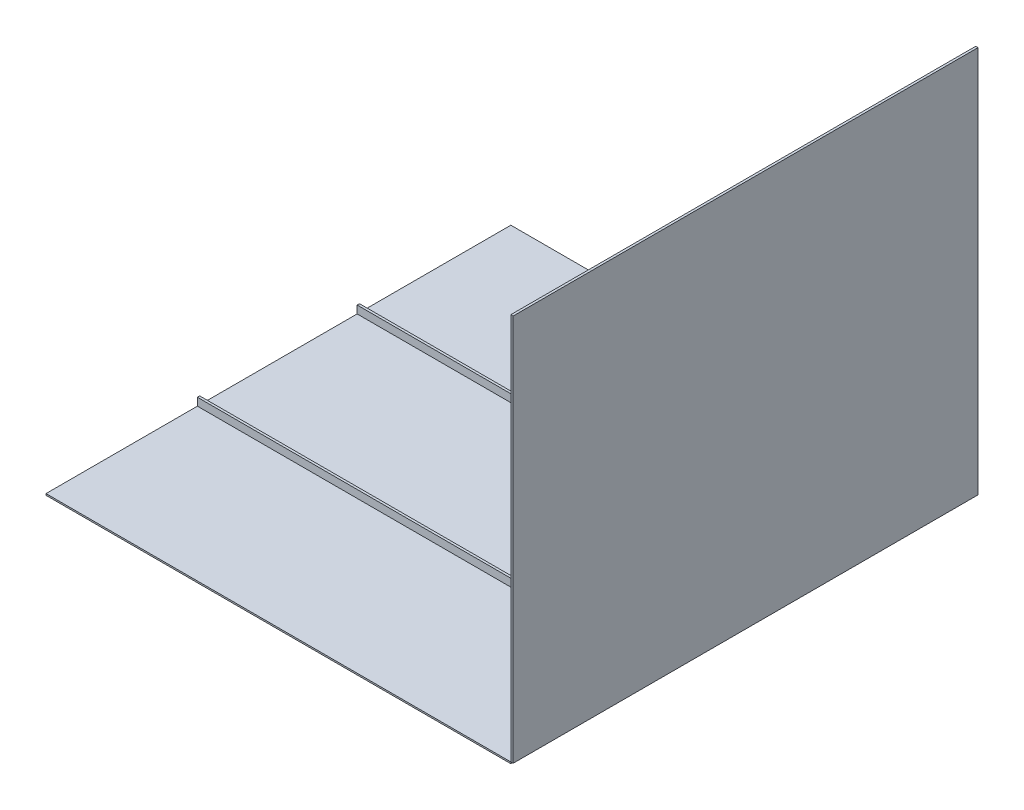
ISO-10303-21;
HEADER;
FILE_DESCRIPTION(('STEP AP214'),'2;1');
FILE_NAME('part.step','',(''),(''),'','','');
FILE_SCHEMA(('AUTOMOTIVE_DESIGN { 1 0 10303 214 1 1 1 1 }'));
ENDSEC;
DATA;
#1=APPLICATION_CONTEXT('core data for automotive mechanical design processes');
#2=APPLICATION_PROTOCOL_DEFINITION('international standard','automotive_design',2000,#1);
#3=PRODUCT_CONTEXT('',#1,'mechanical');
#4=PRODUCT('Part','Part','',(#3));
#5=PRODUCT_RELATED_PRODUCT_CATEGORY('part','',(#4));
#6=PRODUCT_DEFINITION_FORMATION('','',#4);
#7=PRODUCT_DEFINITION_CONTEXT('part definition',#1,'design');
#8=PRODUCT_DEFINITION('design','',#6,#7);
#9=PRODUCT_DEFINITION_SHAPE('','',#8);
#10=(LENGTH_UNIT() NAMED_UNIT(*) SI_UNIT(.MILLI.,.METRE.));
#11=(NAMED_UNIT(*) PLANE_ANGLE_UNIT() SI_UNIT($,.RADIAN.));
#12=(NAMED_UNIT(*) SI_UNIT($,.STERADIAN.) SOLID_ANGLE_UNIT());
#13=UNCERTAINTY_MEASURE_WITH_UNIT(LENGTH_MEASURE(1.E-05),#10,'distance_accuracy_value','');
#14=(GEOMETRIC_REPRESENTATION_CONTEXT(3) GLOBAL_UNCERTAINTY_ASSIGNED_CONTEXT((#13)) GLOBAL_UNIT_ASSIGNED_CONTEXT((#10,
#11,#12)) REPRESENTATION_CONTEXT('',''));
#15=CARTESIAN_POINT('',(0.,0.,0.));
#16=DIRECTION('',(0.,0.,1.));
#17=DIRECTION('',(1.,0.,0.));
#18=AXIS2_PLACEMENT_3D('',#15,#16,#17);
#19=CARTESIAN_POINT('',(300.,502.,-300.));
#20=DIRECTION('',(1.,0.,0.));
#21=DIRECTION('',(0.,0.,-1.));
#22=AXIS2_PLACEMENT_3D('',#19,#20,#21);
#23=PLANE('',#22);
#24=DIRECTION('',(0.,0.,1.));
#25=VECTOR('',#24,1.);
#26=CARTESIAN_POINT('',(300.,2.,-300.));
#27=LINE('',#26,#25);
#28=CARTESIAN_POINT('',(300.,2.,-300.));
#29=VERTEX_POINT('',#28);
#30=CARTESIAN_POINT('',(300.,2.,300.));
#31=VERTEX_POINT('',#30);
#32=EDGE_CURVE('E115',#29,#31,#27,.T.);
#33=ORIENTED_EDGE('',*,*,#32,.T.);
#34=DIRECTION('',(0.,-1.,0.));
#35=VECTOR('',#34,1.);
#36=CARTESIAN_POINT('',(300.,502.,300.));
#37=LINE('',#36,#35);
#38=CARTESIAN_POINT('',(300.,502.,300.));
#39=VERTEX_POINT('',#38);
#40=EDGE_CURVE('E12',#39,#31,#37,.T.);
#41=ORIENTED_EDGE('',*,*,#40,.F.);
#42=DIRECTION('',(0.,0.,1.));
#43=VECTOR('',#42,1.);
#44=CARTESIAN_POINT('',(300.,502.,-300.));
#45=LINE('',#44,#43);
#46=CARTESIAN_POINT('',(300.,502.,-300.));
#47=VERTEX_POINT('',#46);
#48=EDGE_CURVE('E103',#47,#39,#45,.T.);
#49=ORIENTED_EDGE('',*,*,#48,.F.);
#50=DIRECTION('',(0.,-1.,0.));
#51=VECTOR('',#50,1.);
#52=CARTESIAN_POINT('',(300.,502.,-300.));
#53=LINE('',#52,#51);
#54=EDGE_CURVE('E111',#47,#29,#53,.T.);
#55=ORIENTED_EDGE('',*,*,#54,.T.);
#56=EDGE_LOOP('',(#33,#41,#49,#55));
#57=FACE_BOUND('',#56,.T.);
#58=ADVANCED_FACE('F52',(#57),#23,.F.);
#59=CARTESIAN_POINT('',(300.,502.,300.));
#60=DIRECTION('',(0.,0.,-1.));
#61=DIRECTION('',(-1.,0.,0.));
#62=AXIS2_PLACEMENT_3D('',#59,#60,#61);
#63=PLANE('',#62);
#64=DIRECTION('',(1.,0.,0.));
#65=VECTOR('',#64,1.);
#66=CARTESIAN_POINT('',(300.,2.,300.));
#67=LINE('',#66,#65);
#68=CARTESIAN_POINT('',(303.,2.,300.));
#69=VERTEX_POINT('',#68);
#70=EDGE_CURVE('E107',#31,#69,#67,.T.);
#71=ORIENTED_EDGE('',*,*,#70,.T.);
#72=DIRECTION('',(0.,-1.,0.));
#73=VECTOR('',#72,1.);
#74=CARTESIAN_POINT('',(303.,502.,300.));
#75=LINE('',#74,#73);
#76=CARTESIAN_POINT('',(303.,502.,300.));
#77=VERTEX_POINT('',#76);
#78=EDGE_CURVE('E60',#77,#69,#75,.T.);
#79=ORIENTED_EDGE('',*,*,#78,.F.);
#80=DIRECTION('',(1.,0.,0.));
#81=VECTOR('',#80,1.);
#82=CARTESIAN_POINT('',(300.,502.,300.));
#83=LINE('',#82,#81);
#84=EDGE_CURVE('E98',#39,#77,#83,.T.);
#85=ORIENTED_EDGE('',*,*,#84,.F.);
#86=ORIENTED_EDGE('',*,*,#40,.T.);
#87=EDGE_LOOP('',(#71,#79,#85,#86));
#88=FACE_BOUND('',#87,.T.);
#89=ADVANCED_FACE('F106',(#88),#63,.F.);
#90=CARTESIAN_POINT('',(303.,502.,-300.));
#91=DIRECTION('',(-1.,0.,0.));
#92=DIRECTION('',(0.,0.,1.));
#93=AXIS2_PLACEMENT_3D('',#90,#91,#92);
#94=PLANE('',#93);
#95=DIRECTION('',(0.,0.,-1.));
#96=VECTOR('',#95,1.);
#97=CARTESIAN_POINT('',(303.,2.,-300.));
#98=LINE('',#97,#96);
#99=CARTESIAN_POINT('',(303.,2.,-300.));
#100=VERTEX_POINT('',#99);
#101=EDGE_CURVE('E85',#69,#100,#98,.T.);
#102=ORIENTED_EDGE('',*,*,#101,.T.);
#103=DIRECTION('',(0.,-1.,0.));
#104=VECTOR('',#103,1.);
#105=CARTESIAN_POINT('',(303.,502.,-300.));
#106=LINE('',#105,#104);
#107=CARTESIAN_POINT('',(303.,502.,-300.));
#108=VERTEX_POINT('',#107);
#109=EDGE_CURVE('E108',#108,#100,#106,.T.);
#110=ORIENTED_EDGE('',*,*,#109,.F.);
#111=DIRECTION('',(0.,0.,-1.));
#112=VECTOR('',#111,1.);
#113=CARTESIAN_POINT('',(303.,502.,-300.));
#114=LINE('',#113,#112);
#115=EDGE_CURVE('E101',#77,#108,#114,.T.);
#116=ORIENTED_EDGE('',*,*,#115,.F.);
#117=ORIENTED_EDGE('',*,*,#78,.T.);
#118=EDGE_LOOP('',(#102,#110,#116,#117));
#119=FACE_BOUND('',#118,.T.);
#120=ADVANCED_FACE('F109',(#119),#94,.F.);
#121=CARTESIAN_POINT('',(300.,502.,-300.));
#122=DIRECTION('',(0.,0.,1.));
#123=DIRECTION('',(1.,0.,0.));
#124=AXIS2_PLACEMENT_3D('',#121,#122,#123);
#125=PLANE('',#124);
#126=DIRECTION('',(-1.,0.,0.));
#127=VECTOR('',#126,1.);
#128=CARTESIAN_POINT('',(300.,2.,-300.));
#129=LINE('',#128,#127);
#130=EDGE_CURVE('E91',#100,#29,#129,.T.);
#131=ORIENTED_EDGE('',*,*,#130,.T.);
#132=ORIENTED_EDGE('',*,*,#54,.F.);
#133=DIRECTION('',(-1.,0.,0.));
#134=VECTOR('',#133,1.);
#135=CARTESIAN_POINT('',(300.,502.,-300.));
#136=LINE('',#135,#134);
#137=EDGE_CURVE('E68',#108,#47,#136,.T.);
#138=ORIENTED_EDGE('',*,*,#137,.F.);
#139=ORIENTED_EDGE('',*,*,#109,.T.);
#140=EDGE_LOOP('',(#131,#132,#138,#139));
#141=FACE_BOUND('',#140,.T.);
#142=ADVANCED_FACE('F122',(#141),#125,.F.);
#143=CARTESIAN_POINT('',(0.,502.,0.));
#144=DIRECTION('',(0.,1.,0.));
#145=DIRECTION('',(0.,0.,1.));
#146=AXIS2_PLACEMENT_3D('',#143,#144,#145);
#147=PLANE('',#146);
#148=ORIENTED_EDGE('',*,*,#48,.T.);
#149=ORIENTED_EDGE('',*,*,#84,.T.);
#150=ORIENTED_EDGE('',*,*,#115,.T.);
#151=ORIENTED_EDGE('',*,*,#137,.T.);
#152=EDGE_LOOP('',(#148,#149,#150,#151));
#153=FACE_BOUND('',#152,.T.);
#154=ADVANCED_FACE('F99',(#153),#147,.T.);
#155=CARTESIAN_POINT('',(0.,2.,0.));
#156=DIRECTION('',(0.,1.,0.));
#157=DIRECTION('',(0.,0.,1.));
#158=AXIS2_PLACEMENT_3D('',#155,#156,#157);
#159=PLANE('',#158);
#160=ORIENTED_EDGE('',*,*,#32,.F.);
#161=ORIENTED_EDGE('',*,*,#130,.F.);
#162=ORIENTED_EDGE('',*,*,#101,.F.);
#163=ORIENTED_EDGE('',*,*,#70,.F.);
#164=EDGE_LOOP('',(#160,#161,#162,#163));
#165=FACE_BOUND('',#164,.T.);
#166=ADVANCED_FACE('F125',(#165),#159,.F.);
#167=CLOSED_SHELL('',(#58,#89,#120,#142,#154,#166));
#168=MANIFOLD_SOLID_BREP('B2',#167);
#169=CARTESIAN_POINT('',(0.,2.,0.));
#170=DIRECTION('',(0.,1.,0.));
#171=DIRECTION('',(0.,0.,1.));
#172=AXIS2_PLACEMENT_3D('',#169,#170,#171);
#173=PLANE('',#172);
#174=DIRECTION('',(0.,0.,-1.));
#175=VECTOR('',#174,1.);
#176=CARTESIAN_POINT('',(299.287070965988,2.,101.6));
#177=LINE('',#176,#175);
#178=CARTESIAN_POINT('',(299.287070965988,2.,104.6));
#179=VERTEX_POINT('',#178);
#180=CARTESIAN_POINT('',(299.287070965988,2.,101.6));
#181=VERTEX_POINT('',#180);
#182=EDGE_CURVE('E503',#179,#181,#177,.T.);
#183=ORIENTED_EDGE('',*,*,#182,.F.);
#184=DIRECTION('',(1.,0.,0.));
#185=VECTOR('',#184,1.);
#186=CARTESIAN_POINT('',(-300.,2.,104.6));
#187=LINE('',#186,#185);
#188=CARTESIAN_POINT('',(-300.,2.,104.6));
#189=VERTEX_POINT('',#188);
#190=EDGE_CURVE('E378',#189,#179,#187,.T.);
#191=ORIENTED_EDGE('',*,*,#190,.F.);
#192=DIRECTION('',(0.,0.,1.));
#193=VECTOR('',#192,1.);
#194=CARTESIAN_POINT('',(-300.,2.,300.));
#195=LINE('',#194,#193);
#196=CARTESIAN_POINT('',(-300.,2.,300.));
#197=VERTEX_POINT('',#196);
#198=EDGE_CURVE('E288',#189,#197,#195,.T.);
#199=ORIENTED_EDGE('',*,*,#198,.T.);
#200=DIRECTION('',(1.,0.,0.));
#201=VECTOR('',#200,1.);
#202=CARTESIAN_POINT('',(300.,2.,300.));
#203=LINE('',#202,#201);
#204=CARTESIAN_POINT('',(300.,2.,300.));
#205=VERTEX_POINT('',#204);
#206=EDGE_CURVE('E323',#197,#205,#203,.T.);
#207=ORIENTED_EDGE('',*,*,#206,.T.);
#208=DIRECTION('',(0.,0.,-1.));
#209=VECTOR('',#208,1.);
#210=CARTESIAN_POINT('',(300.,2.,300.));
#211=LINE('',#210,#209);
#212=CARTESIAN_POINT('',(300.,2.,-300.));
#213=VERTEX_POINT('',#212);
#214=EDGE_CURVE('E326',#205,#213,#211,.T.);
#215=ORIENTED_EDGE('',*,*,#214,.T.);
#216=DIRECTION('',(-1.,0.,0.));
#217=VECTOR('',#216,1.);
#218=CARTESIAN_POINT('',(300.,2.,-300.));
#219=LINE('',#218,#217);
#220=CARTESIAN_POINT('',(-300.,2.,-300.));
#221=VERTEX_POINT('',#220);
#222=EDGE_CURVE('E328',#213,#221,#219,.T.);
#223=ORIENTED_EDGE('',*,*,#222,.T.);
#224=CARTESIAN_POINT('',(-300.,2.,-104.6));
#225=VERTEX_POINT('',#224);
#226=EDGE_CURVE('E321',#221,#225,#195,.T.);
#227=ORIENTED_EDGE('',*,*,#226,.T.);
#228=DIRECTION('',(-1.,0.,0.));
#229=VECTOR('',#228,1.);
#230=CARTESIAN_POINT('',(-300.,2.,-104.6));
#231=LINE('',#230,#229);
#232=CARTESIAN_POINT('',(292.256000525583,2.,-104.6));
#233=VERTEX_POINT('',#232);
#234=EDGE_CURVE('E198',#233,#225,#231,.T.);
#235=ORIENTED_EDGE('',*,*,#234,.F.);
#236=DIRECTION('',(0.,0.,-1.));
#237=VECTOR('',#236,1.);
#238=CARTESIAN_POINT('',(292.256000525583,2.,-104.6));
#239=LINE('',#238,#237);
#240=CARTESIAN_POINT('',(292.256000525583,2.,-101.6));
#241=VERTEX_POINT('',#240);
#242=EDGE_CURVE('E292',#241,#233,#239,.T.);
#243=ORIENTED_EDGE('',*,*,#242,.F.);
#244=DIRECTION('',(1.,0.,0.));
#245=VECTOR('',#244,1.);
#246=CARTESIAN_POINT('',(-300.,2.,-101.6));
#247=LINE('',#246,#245);
#248=CARTESIAN_POINT('',(-300.,2.,-101.6));
#249=VERTEX_POINT('',#248);
#250=EDGE_CURVE('E289',#249,#241,#247,.T.);
#251=ORIENTED_EDGE('',*,*,#250,.F.);
#252=CARTESIAN_POINT('',(-300.,2.,101.6));
#253=VERTEX_POINT('',#252);
#254=EDGE_CURVE('E324',#249,#253,#195,.T.);
#255=ORIENTED_EDGE('',*,*,#254,.T.);
#256=DIRECTION('',(-1.,0.,0.));
#257=VECTOR('',#256,1.);
#258=CARTESIAN_POINT('',(-300.,2.,101.6));
#259=LINE('',#258,#257);
#260=EDGE_CURVE('E283',#181,#253,#259,.T.);
#261=ORIENTED_EDGE('',*,*,#260,.F.);
#262=EDGE_LOOP('',(#183,#191,#199,#207,#215,#223,#227,#235,#243,#251,#255,#261));
#263=FACE_BOUND('',#262,.T.);
#264=ADVANCED_FACE('F175',(#263),#173,.T.);
#265=CARTESIAN_POINT('',(-300.,2.,300.));
#266=DIRECTION('',(1.,0.,0.));
#267=DIRECTION('',(0.,0.,-1.));
#268=AXIS2_PLACEMENT_3D('',#265,#266,#267);
#269=PLANE('',#268);
#270=DIRECTION('',(0.,0.,1.));
#271=VECTOR('',#270,1.);
#272=CARTESIAN_POINT('',(-300.,0.,300.));
#273=LINE('',#272,#271);
#274=CARTESIAN_POINT('',(-300.,0.,-300.));
#275=VERTEX_POINT('',#274);
#276=CARTESIAN_POINT('',(-300.,0.,300.));
#277=VERTEX_POINT('',#276);
#278=EDGE_CURVE('E320',#275,#277,#273,.T.);
#279=ORIENTED_EDGE('',*,*,#278,.T.);
#280=DIRECTION('',(0.,-1.,0.));
#281=VECTOR('',#280,1.);
#282=CARTESIAN_POINT('',(-300.,2.,300.));
#283=LINE('',#282,#281);
#284=EDGE_CURVE('E50',#197,#277,#283,.T.);
#285=ORIENTED_EDGE('',*,*,#284,.F.);
#286=ORIENTED_EDGE('',*,*,#198,.F.);
#287=DIRECTION('',(0.,-1.,0.));
#288=VECTOR('',#287,1.);
#289=CARTESIAN_POINT('',(-300.,12.,104.6));
#290=LINE('',#289,#288);
#291=CARTESIAN_POINT('',(-300.,12.,104.6));
#292=VERTEX_POINT('',#291);
#293=EDGE_CURVE('E268',#292,#189,#290,.T.);
#294=ORIENTED_EDGE('',*,*,#293,.F.);
#295=DIRECTION('',(0.,0.,1.));
#296=VECTOR('',#295,1.);
#297=CARTESIAN_POINT('',(-300.,12.,101.6));
#298=LINE('',#297,#296);
#299=CARTESIAN_POINT('',(-300.,12.,101.6));
#300=VERTEX_POINT('',#299);
#301=EDGE_CURVE('E275',#300,#292,#298,.T.);
#302=ORIENTED_EDGE('',*,*,#301,.F.);
#303=DIRECTION('',(0.,-1.,0.));
#304=VECTOR('',#303,1.);
#305=CARTESIAN_POINT('',(-300.,12.,101.6));
#306=LINE('',#305,#304);
#307=EDGE_CURVE('E376',#300,#253,#306,.T.);
#308=ORIENTED_EDGE('',*,*,#307,.T.);
#309=ORIENTED_EDGE('',*,*,#254,.F.);
#310=DIRECTION('',(0.,-1.,0.));
#311=VECTOR('',#310,1.);
#312=CARTESIAN_POINT('',(-300.,12.,-101.6));
#313=LINE('',#312,#311);
#314=CARTESIAN_POINT('',(-300.,12.,-101.6));
#315=VERTEX_POINT('',#314);
#316=EDGE_CURVE('E317',#315,#249,#313,.T.);
#317=ORIENTED_EDGE('',*,*,#316,.F.);
#318=DIRECTION('',(0.,0.,1.));
#319=VECTOR('',#318,1.);
#320=CARTESIAN_POINT('',(-300.,12.,-104.6));
#321=LINE('',#320,#319);
#322=CARTESIAN_POINT('',(-300.,12.,-104.6));
#323=VERTEX_POINT('',#322);
#324=EDGE_CURVE('E297',#323,#315,#321,.T.);
#325=ORIENTED_EDGE('',*,*,#324,.F.);
#326=DIRECTION('',(0.,-1.,0.));
#327=VECTOR('',#326,1.);
#328=CARTESIAN_POINT('',(-300.,12.,-104.6));
#329=LINE('',#328,#327);
#330=EDGE_CURVE('E305',#323,#225,#329,.T.);
#331=ORIENTED_EDGE('',*,*,#330,.T.);
#332=ORIENTED_EDGE('',*,*,#226,.F.);
#333=DIRECTION('',(0.,-1.,0.));
#334=VECTOR('',#333,1.);
#335=CARTESIAN_POINT('',(-300.,2.,-300.));
#336=LINE('',#335,#334);
#337=EDGE_CURVE('E330',#221,#275,#336,.T.);
#338=ORIENTED_EDGE('',*,*,#337,.T.);
#339=EDGE_LOOP('',(#279,#285,#286,#294,#302,#308,#309,#317,#325,#331,#332,#338));
#340=FACE_BOUND('',#339,.T.);
#341=ADVANCED_FACE('F177',(#340),#269,.F.);
#342=CARTESIAN_POINT('',(300.,2.,300.));
#343=DIRECTION('',(0.,0.,-1.));
#344=DIRECTION('',(-1.,0.,0.));
#345=AXIS2_PLACEMENT_3D('',#342,#343,#344);
#346=PLANE('',#345);
#347=DIRECTION('',(1.,0.,0.));
#348=VECTOR('',#347,1.);
#349=CARTESIAN_POINT('',(300.,0.,300.));
#350=LINE('',#349,#348);
#351=CARTESIAN_POINT('',(300.,0.,300.));
#352=VERTEX_POINT('',#351);
#353=EDGE_CURVE('E332',#277,#352,#350,.T.);
#354=ORIENTED_EDGE('',*,*,#353,.T.);
#355=DIRECTION('',(0.,-1.,0.));
#356=VECTOR('',#355,1.);
#357=CARTESIAN_POINT('',(300.,2.,300.));
#358=LINE('',#357,#356);
#359=EDGE_CURVE('E183',#205,#352,#358,.T.);
#360=ORIENTED_EDGE('',*,*,#359,.F.);
#361=ORIENTED_EDGE('',*,*,#206,.F.);
#362=ORIENTED_EDGE('',*,*,#284,.T.);
#363=EDGE_LOOP('',(#354,#360,#361,#362));
#364=FACE_BOUND('',#363,.T.);
#365=ADVANCED_FACE('F379',(#364),#346,.F.);
#366=CARTESIAN_POINT('',(300.,2.,300.));
#367=DIRECTION('',(-1.,0.,0.));
#368=DIRECTION('',(0.,0.,1.));
#369=AXIS2_PLACEMENT_3D('',#366,#367,#368);
#370=PLANE('',#369);
#371=DIRECTION('',(0.,0.,-1.));
#372=VECTOR('',#371,1.);
#373=CARTESIAN_POINT('',(300.,0.,300.));
#374=LINE('',#373,#372);
#375=CARTESIAN_POINT('',(300.,0.,-300.));
#376=VERTEX_POINT('',#375);
#377=EDGE_CURVE('E334',#352,#376,#374,.T.);
#378=ORIENTED_EDGE('',*,*,#377,.T.);
#379=DIRECTION('',(0.,-1.,0.));
#380=VECTOR('',#379,1.);
#381=CARTESIAN_POINT('',(300.,2.,-300.));
#382=LINE('',#381,#380);
#383=EDGE_CURVE('E340',#213,#376,#382,.T.);
#384=ORIENTED_EDGE('',*,*,#383,.F.);
#385=ORIENTED_EDGE('',*,*,#214,.F.);
#386=ORIENTED_EDGE('',*,*,#359,.T.);
#387=EDGE_LOOP('',(#378,#384,#385,#386));
#388=FACE_BOUND('',#387,.T.);
#389=ADVANCED_FACE('F347',(#388),#370,.F.);
#390=CARTESIAN_POINT('',(300.,2.,-300.));
#391=DIRECTION('',(0.,0.,1.));
#392=DIRECTION('',(1.,0.,0.));
#393=AXIS2_PLACEMENT_3D('',#390,#391,#392);
#394=PLANE('',#393);
#395=DIRECTION('',(-1.,0.,0.));
#396=VECTOR('',#395,1.);
#397=CARTESIAN_POINT('',(300.,0.,-300.));
#398=LINE('',#397,#396);
#399=EDGE_CURVE('E336',#376,#275,#398,.T.);
#400=ORIENTED_EDGE('',*,*,#399,.T.);
#401=ORIENTED_EDGE('',*,*,#337,.F.);
#402=ORIENTED_EDGE('',*,*,#222,.F.);
#403=ORIENTED_EDGE('',*,*,#383,.T.);
#404=EDGE_LOOP('',(#400,#401,#402,#403));
#405=FACE_BOUND('',#404,.T.);
#406=ADVANCED_FACE('F357',(#405),#394,.F.);
#407=CARTESIAN_POINT('',(0.,0.,0.));
#408=DIRECTION('',(0.,1.,0.));
#409=DIRECTION('',(0.,0.,1.));
#410=AXIS2_PLACEMENT_3D('',#407,#408,#409);
#411=PLANE('',#410);
#412=ORIENTED_EDGE('',*,*,#278,.F.);
#413=ORIENTED_EDGE('',*,*,#399,.F.);
#414=ORIENTED_EDGE('',*,*,#377,.F.);
#415=ORIENTED_EDGE('',*,*,#353,.F.);
#416=EDGE_LOOP('',(#412,#413,#414,#415));
#417=FACE_BOUND('',#416,.T.);
#418=ADVANCED_FACE('F354',(#417),#411,.F.);
#419=CARTESIAN_POINT('',(-300.,12.,-101.6));
#420=DIRECTION('',(0.,0.,-1.));
#421=DIRECTION('',(-1.,0.,0.));
#422=AXIS2_PLACEMENT_3D('',#419,#420,#421);
#423=PLANE('',#422);
#424=ORIENTED_EDGE('',*,*,#250,.T.);
#425=DIRECTION('',(0.,-1.,0.));
#426=VECTOR('',#425,1.);
#427=CARTESIAN_POINT('',(292.256000525583,12.,-101.6));
#428=LINE('',#427,#426);
#429=CARTESIAN_POINT('',(292.256000525583,12.,-101.6));
#430=VERTEX_POINT('',#429);
#431=EDGE_CURVE('E314',#430,#241,#428,.T.);
#432=ORIENTED_EDGE('',*,*,#431,.F.);
#433=DIRECTION('',(1.,0.,0.));
#434=VECTOR('',#433,1.);
#435=CARTESIAN_POINT('',(-300.,12.,-101.6));
#436=LINE('',#435,#434);
#437=EDGE_CURVE('E300',#315,#430,#436,.T.);
#438=ORIENTED_EDGE('',*,*,#437,.F.);
#439=ORIENTED_EDGE('',*,*,#316,.T.);
#440=EDGE_LOOP('',(#424,#432,#438,#439));
#441=FACE_BOUND('',#440,.T.);
#442=ADVANCED_FACE('F374',(#441),#423,.F.);
#443=CARTESIAN_POINT('',(292.256000525583,12.,-104.6));
#444=DIRECTION('',(-1.,0.,0.));
#445=DIRECTION('',(0.,0.,1.));
#446=AXIS2_PLACEMENT_3D('',#443,#444,#445);
#447=PLANE('',#446);
#448=ORIENTED_EDGE('',*,*,#242,.T.);
#449=DIRECTION('',(0.,-1.,0.));
#450=VECTOR('',#449,1.);
#451=CARTESIAN_POINT('',(292.256000525583,12.,-104.6));
#452=LINE('',#451,#450);
#453=CARTESIAN_POINT('',(292.256000525583,12.,-104.6));
#454=VERTEX_POINT('',#453);
#455=EDGE_CURVE('E311',#454,#233,#452,.T.);
#456=ORIENTED_EDGE('',*,*,#455,.F.);
#457=DIRECTION('',(0.,0.,-1.));
#458=VECTOR('',#457,1.);
#459=CARTESIAN_POINT('',(292.256000525583,12.,-104.6));
#460=LINE('',#459,#458);
#461=EDGE_CURVE('E302',#430,#454,#460,.T.);
#462=ORIENTED_EDGE('',*,*,#461,.F.);
#463=ORIENTED_EDGE('',*,*,#431,.T.);
#464=EDGE_LOOP('',(#448,#456,#462,#463));
#465=FACE_BOUND('',#464,.T.);
#466=ADVANCED_FACE('F369',(#465),#447,.F.);
#467=CARTESIAN_POINT('',(-300.,12.,-104.6));
#468=DIRECTION('',(0.,0.,1.));
#469=DIRECTION('',(1.,0.,0.));
#470=AXIS2_PLACEMENT_3D('',#467,#468,#469);
#471=PLANE('',#470);
#472=ORIENTED_EDGE('',*,*,#234,.T.);
#473=ORIENTED_EDGE('',*,*,#330,.F.);
#474=DIRECTION('',(-1.,0.,0.));
#475=VECTOR('',#474,1.);
#476=CARTESIAN_POINT('',(-300.,12.,-104.6));
#477=LINE('',#476,#475);
#478=EDGE_CURVE('E304',#454,#323,#477,.T.);
#479=ORIENTED_EDGE('',*,*,#478,.F.);
#480=ORIENTED_EDGE('',*,*,#455,.T.);
#481=EDGE_LOOP('',(#472,#473,#479,#480));
#482=FACE_BOUND('',#481,.T.);
#483=ADVANCED_FACE('F364',(#482),#471,.F.);
#484=CARTESIAN_POINT('',(0.,12.,0.));
#485=DIRECTION('',(0.,1.,0.));
#486=DIRECTION('',(0.,0.,1.));
#487=AXIS2_PLACEMENT_3D('',#484,#485,#486);
#488=PLANE('',#487);
#489=ORIENTED_EDGE('',*,*,#324,.T.);
#490=ORIENTED_EDGE('',*,*,#437,.T.);
#491=ORIENTED_EDGE('',*,*,#461,.T.);
#492=ORIENTED_EDGE('',*,*,#478,.T.);
#493=EDGE_LOOP('',(#489,#490,#491,#492));
#494=FACE_BOUND('',#493,.T.);
#495=ADVANCED_FACE('F422',(#494),#488,.T.);
#496=CARTESIAN_POINT('',(-300.,12.,104.6));
#497=DIRECTION('',(0.,0.,-1.));
#498=DIRECTION('',(-1.,0.,0.));
#499=AXIS2_PLACEMENT_3D('',#496,#497,#498);
#500=PLANE('',#499);
#501=ORIENTED_EDGE('',*,*,#190,.T.);
#502=DIRECTION('',(0.,-1.,0.));
#503=VECTOR('',#502,1.);
#504=CARTESIAN_POINT('',(299.287070965988,12.,104.6));
#505=LINE('',#504,#503);
#506=CARTESIAN_POINT('',(299.287070965988,12.,104.6));
#507=VERTEX_POINT('',#506);
#508=EDGE_CURVE('E271',#507,#179,#505,.T.);
#509=ORIENTED_EDGE('',*,*,#508,.F.);
#510=DIRECTION('',(1.,0.,0.));
#511=VECTOR('',#510,1.);
#512=CARTESIAN_POINT('',(-300.,12.,104.6));
#513=LINE('',#512,#511);
#514=EDGE_CURVE('E264',#292,#507,#513,.T.);
#515=ORIENTED_EDGE('',*,*,#514,.F.);
#516=ORIENTED_EDGE('',*,*,#293,.T.);
#517=EDGE_LOOP('',(#501,#509,#515,#516));
#518=FACE_BOUND('',#517,.T.);
#519=ADVANCED_FACE('F266',(#518),#500,.F.);
#520=CARTESIAN_POINT('',(299.287070965988,12.,101.6));
#521=DIRECTION('',(-1.,0.,0.));
#522=DIRECTION('',(0.,0.,1.));
#523=AXIS2_PLACEMENT_3D('',#520,#521,#522);
#524=PLANE('',#523);
#525=ORIENTED_EDGE('',*,*,#182,.T.);
#526=DIRECTION('',(0.,-1.,0.));
#527=VECTOR('',#526,1.);
#528=CARTESIAN_POINT('',(299.287070965988,12.,101.6));
#529=LINE('',#528,#527);
#530=CARTESIAN_POINT('',(299.287070965988,12.,101.6));
#531=VERTEX_POINT('',#530);
#532=EDGE_CURVE('E190',#531,#181,#529,.T.);
#533=ORIENTED_EDGE('',*,*,#532,.F.);
#534=DIRECTION('',(0.,0.,-1.));
#535=VECTOR('',#534,1.);
#536=CARTESIAN_POINT('',(299.287070965988,12.,101.6));
#537=LINE('',#536,#535);
#538=EDGE_CURVE('E274',#507,#531,#537,.T.);
#539=ORIENTED_EDGE('',*,*,#538,.F.);
#540=ORIENTED_EDGE('',*,*,#508,.T.);
#541=EDGE_LOOP('',(#525,#533,#539,#540));
#542=FACE_BOUND('',#541,.T.);
#543=ADVANCED_FACE('F436',(#542),#524,.F.);
#544=CARTESIAN_POINT('',(-300.,12.,101.6));
#545=DIRECTION('',(0.,0.,1.));
#546=DIRECTION('',(1.,0.,0.));
#547=AXIS2_PLACEMENT_3D('',#544,#545,#546);
#548=PLANE('',#547);
#549=ORIENTED_EDGE('',*,*,#260,.T.);
#550=ORIENTED_EDGE('',*,*,#307,.F.);
#551=DIRECTION('',(-1.,0.,0.));
#552=VECTOR('',#551,1.);
#553=CARTESIAN_POINT('',(-300.,12.,101.6));
#554=LINE('',#553,#552);
#555=EDGE_CURVE('E279',#531,#300,#554,.T.);
#556=ORIENTED_EDGE('',*,*,#555,.F.);
#557=ORIENTED_EDGE('',*,*,#532,.T.);
#558=EDGE_LOOP('',(#549,#550,#556,#557));
#559=FACE_BOUND('',#558,.T.);
#560=ADVANCED_FACE('F443',(#559),#548,.F.);
#561=CARTESIAN_POINT('',(0.,12.,0.));
#562=DIRECTION('',(0.,1.,0.));
#563=DIRECTION('',(0.,0.,1.));
#564=AXIS2_PLACEMENT_3D('',#561,#562,#563);
#565=PLANE('',#564);
#566=ORIENTED_EDGE('',*,*,#301,.T.);
#567=ORIENTED_EDGE('',*,*,#514,.T.);
#568=ORIENTED_EDGE('',*,*,#538,.T.);
#569=ORIENTED_EDGE('',*,*,#555,.T.);
#570=EDGE_LOOP('',(#566,#567,#568,#569));
#571=FACE_BOUND('',#570,.T.);
#572=ADVANCED_FACE('F278',(#571),#565,.T.);
#573=CLOSED_SHELL('',(#264,#341,#365,#389,#406,#418,#442,#466,#483,#495,#519,#543,#560,#572));
#574=MANIFOLD_SOLID_BREP('B6',#573);
#575=ADVANCED_BREP_SHAPE_REPRESENTATION('',(#18,#168,#574),#14);
#576=SHAPE_DEFINITION_REPRESENTATION(#9,#575);
ENDSEC;
END-ISO-10303-21;
